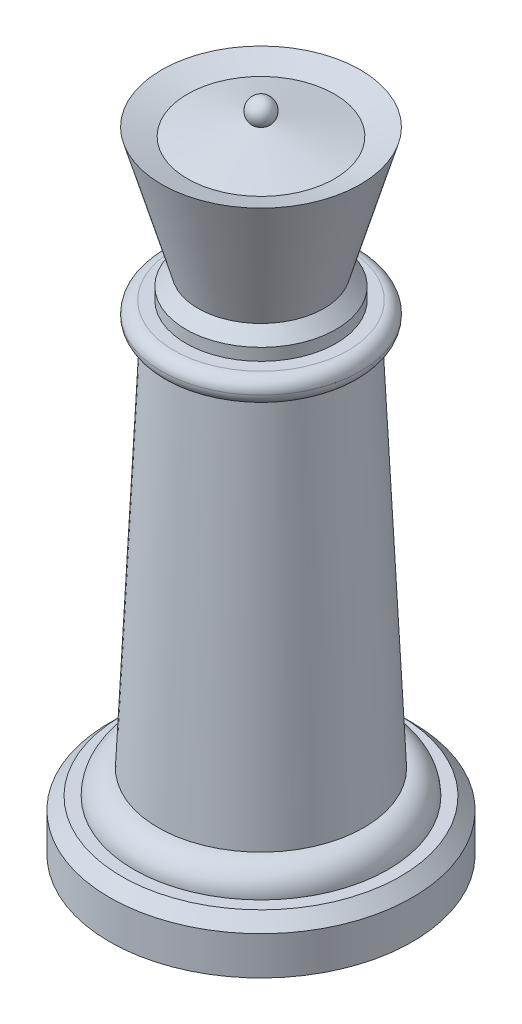
ISO-10303-21;
HEADER;
FILE_DESCRIPTION(('STEP AP214'),'2;1');
FILE_NAME('part.step','',(''),(''),'','','');
FILE_SCHEMA(('AUTOMOTIVE_DESIGN { 1 0 10303 214 1 1 1 1 }'));
ENDSEC;
DATA;
#1=APPLICATION_CONTEXT('core data for automotive mechanical design processes');
#2=APPLICATION_PROTOCOL_DEFINITION('international standard','automotive_design',2000,#1);
#3=PRODUCT_CONTEXT('',#1,'mechanical');
#4=PRODUCT('Part','Part','',(#3));
#5=PRODUCT_RELATED_PRODUCT_CATEGORY('part','',(#4));
#6=PRODUCT_DEFINITION_FORMATION('','',#4);
#7=PRODUCT_DEFINITION_CONTEXT('part definition',#1,'design');
#8=PRODUCT_DEFINITION('design','',#6,#7);
#9=PRODUCT_DEFINITION_SHAPE('','',#8);
#10=(LENGTH_UNIT() NAMED_UNIT(*) SI_UNIT(.MILLI.,.METRE.));
#11=(NAMED_UNIT(*) PLANE_ANGLE_UNIT() SI_UNIT($,.RADIAN.));
#12=(NAMED_UNIT(*) SI_UNIT($,.STERADIAN.) SOLID_ANGLE_UNIT());
#13=UNCERTAINTY_MEASURE_WITH_UNIT(LENGTH_MEASURE(1.E-05),#10,'distance_accuracy_value','');
#14=(GEOMETRIC_REPRESENTATION_CONTEXT(3) GLOBAL_UNCERTAINTY_ASSIGNED_CONTEXT((#13)) GLOBAL_UNIT_ASSIGNED_CONTEXT((#10,
#11,#12)) REPRESENTATION_CONTEXT('',''));
#15=CARTESIAN_POINT('',(0.,0.,0.));
#16=DIRECTION('',(0.,0.,1.));
#17=DIRECTION('',(1.,0.,0.));
#18=AXIS2_PLACEMENT_3D('',#15,#16,#17);
#19=CARTESIAN_POINT('',(0.,40.513,0.));
#20=DIRECTION('',(0.,-1.,0.));
#21=DIRECTION('',(1.,0.,0.));
#22=AXIS2_PLACEMENT_3D('',#19,#20,#21);
#23=SPHERICAL_SURFACE('',#22,0.761999999999999);
#24=CARTESIAN_POINT('',(0.,40.0068172622312,0.));
#25=DIRECTION('',(0.,-1.,0.));
#26=DIRECTION('',(0.,0.,-1.));
#27=AXIS2_PLACEMENT_3D('',#24,#25,#26);
#28=CIRCLE('',#27,0.569581456847854);
#29=CARTESIAN_POINT('',(0.,40.0068172622312,-0.569581456847838));
#30=VERTEX_POINT('',#29);
#31=EDGE_CURVE('E56',#30,#30,#28,.T.);
#32=ORIENTED_EDGE('',*,*,#31,.F.);
#33=EDGE_LOOP('',(#32));
#34=FACE_BOUND('',#33,.T.);
#35=ADVANCED_FACE('F33',(#34),#23,.T.);
#36=CARTESIAN_POINT('',(0.,40.0068172622312,0.));
#37=DIRECTION('',(0.,-1.,0.));
#38=DIRECTION('',(0.,0.,-1.));
#39=AXIS2_PLACEMENT_3D('',#36,#37,#38);
#40=CONICAL_SURFACE('',#39,0.569581456847854,1.3544556654216);
#41=CARTESIAN_POINT('',(0.,39.116,0.));
#42=DIRECTION('',(0.,-1.,0.));
#43=DIRECTION('',(0.,0.,-1.));
#44=AXIS2_PLACEMENT_3D('',#41,#42,#43);
#45=CIRCLE('',#44,4.6228);
#46=CARTESIAN_POINT('',(0.,39.116,-4.62279999999998));
#47=VERTEX_POINT('',#46);
#48=EDGE_CURVE('E59',#47,#47,#45,.T.);
#49=CARTESIAN_POINT('',(0.,39.116,-4.62279999999998));
#50=CARTESIAN_POINT('',(0.,39.1252793464816,-4.58057897350882));
#51=CARTESIAN_POINT('',(0.,39.1345586929632,-4.53835794701765));
#52=CARTESIAN_POINT('',(0.,39.1531173859263,-4.45391589403531));
#53=CARTESIAN_POINT('',(0.,39.1623967324079,-4.41169486754414));
#54=CARTESIAN_POINT('',(0.,39.180955425371,-4.32725281456181));
#55=CARTESIAN_POINT('',(0.,39.1902347718526,-4.28503178807064));
#56=CARTESIAN_POINT('',(0.,39.2087934648158,-4.2005897350883));
#57=CARTESIAN_POINT('',(0.,39.2180728112973,-4.15836870859713));
#58=CARTESIAN_POINT('',(0.,39.2366315042605,-4.0739266556148));
#59=CARTESIAN_POINT('',(0.,39.2459108507421,-4.03170562912363));
#60=CARTESIAN_POINT('',(0.,39.2644695437052,-3.94726357614129));
#61=CARTESIAN_POINT('',(0.,39.2737488901868,-3.90504254965012));
#62=CARTESIAN_POINT('',(0.,39.2923075831499,-3.82060049666779));
#63=CARTESIAN_POINT('',(0.,39.3015869296315,-3.77837947017662));
#64=CARTESIAN_POINT('',(0.,39.3201456225947,-3.69393741719428));
#65=CARTESIAN_POINT('',(0.,39.3294249690762,-3.65171639070312));
#66=CARTESIAN_POINT('',(0.,39.3479836620394,-3.56727433772078));
#67=CARTESIAN_POINT('',(0.,39.357263008521,-3.52505331122961));
#68=CARTESIAN_POINT('',(0.,39.3758217014841,-3.44061125824727));
#69=CARTESIAN_POINT('',(0.,39.3851010479657,-3.39839023175611));
#70=CARTESIAN_POINT('',(0.,39.4036597409288,-3.31394817877377));
#71=CARTESIAN_POINT('',(0.,39.4129390874104,-3.2717271522826));
#72=CARTESIAN_POINT('',(0.,39.4314977803736,-3.18728509930027));
#73=CARTESIAN_POINT('',(0.,39.4407771268551,-3.1450640728091));
#74=CARTESIAN_POINT('',(0.,39.4593358198183,-3.06062201982676));
#75=CARTESIAN_POINT('',(0.,39.4686151662999,-3.01840099333559));
#76=CARTESIAN_POINT('',(0.,39.487173859263,-2.93395894035326));
#77=CARTESIAN_POINT('',(0.,39.4964532057446,-2.89173791386209));
#78=CARTESIAN_POINT('',(0.,39.5150118987077,-2.80729586087975));
#79=CARTESIAN_POINT('',(0.,39.5242912451893,-2.76507483438858));
#80=CARTESIAN_POINT('',(0.,39.5428499381525,-2.68063278140625));
#81=CARTESIAN_POINT('',(0.,39.552129284634,-2.63841175491508));
#82=CARTESIAN_POINT('',(0.,39.5706879775972,-2.55396970193274));
#83=CARTESIAN_POINT('',(0.,39.5799673240788,-2.51174867544157));
#84=CARTESIAN_POINT('',(0.,39.5985260170419,-2.42730662245924));
#85=CARTESIAN_POINT('',(0.,39.6078053635235,-2.38508559596807));
#86=CARTESIAN_POINT('',(0.,39.6263640564867,-2.30064354298573));
#87=CARTESIAN_POINT('',(0.,39.6356434029682,-2.25842251649457));
#88=CARTESIAN_POINT('',(0.,39.6542020959314,-2.17398046351223));
#89=CARTESIAN_POINT('',(0.,39.663481442413,-2.13175943702106));
#90=CARTESIAN_POINT('',(0.,39.6820401353761,-2.04731738403872));
#91=CARTESIAN_POINT('',(0.,39.6913194818577,-2.00509635754756));
#92=CARTESIAN_POINT('',(0.,39.7098781748208,-1.92065430456522));
#93=CARTESIAN_POINT('',(0.,39.7191575213024,-1.87843327807405));
#94=CARTESIAN_POINT('',(0.,39.7377162142656,-1.79399122509172));
#95=CARTESIAN_POINT('',(0.,39.7469955607471,-1.75177019860055));
#96=CARTESIAN_POINT('',(0.,39.7655542537103,-1.66732814561821));
#97=CARTESIAN_POINT('',(0.,39.7748336001919,-1.62510711912704));
#98=CARTESIAN_POINT('',(0.,39.793392293155,-1.54066506614471));
#99=CARTESIAN_POINT('',(0.,39.8026716396366,-1.49844403965354));
#100=CARTESIAN_POINT('',(0.,39.8212303325997,-1.4140019866712));
#101=CARTESIAN_POINT('',(0.,39.8305096790813,-1.37178096018003));
#102=CARTESIAN_POINT('',(0.,39.8490683720445,-1.2873389071977));
#103=CARTESIAN_POINT('',(0.,39.858347718526,-1.24511788070653));
#104=CARTESIAN_POINT('',(0.,39.8769064114892,-1.16067582772419));
#105=CARTESIAN_POINT('',(0.,39.8861857579708,-1.11845480123302));
#106=CARTESIAN_POINT('',(0.,39.9047444509339,-1.03401274825069));
#107=CARTESIAN_POINT('',(0.,39.9140237974155,-0.99179172175952));
#108=CARTESIAN_POINT('',(0.,39.9325824903786,-0.907349668777184));
#109=CARTESIAN_POINT('',(0.,39.9418618368602,-0.865128642286015));
#110=CARTESIAN_POINT('',(0.,39.9604205298234,-0.780686589303679));
#111=CARTESIAN_POINT('',(0.,39.969699876305,-0.738465562812511));
#112=CARTESIAN_POINT('',(0.,39.9882585692681,-0.654023509830175));
#113=CARTESIAN_POINT('',(0.,39.9975379157497,-0.611802483339006));
#114=CARTESIAN_POINT('',(0.,40.0068172622313,-0.569581456847838));
#115=B_SPLINE_CURVE_WITH_KNOTS('',3,(#49,#50,#51,#52,#53,#54,#55,#56,#57,#58,#59,#60,#61,#62,
#63,#64,#65,#66,#67,#68,#69,#70,#71,#72,#73,#74,#75,#76,#77,#78,#79,#80,#81,#82,#83,#84,#85,#86,
#87,#88,#89,#90,#91,#92,#93,#94,#95,#96,#97,#98,#99,#100,#101,#102,#103,#104,#105,#106,#107,
#108,#109,#110,#111,#112,#113,#114),.UNSPECIFIED.,.F.,.F.,(4,2,2,2,2,2,2,2,2,2,2,2,2,2,2,2,2,2,
2,2,2,2,2,2,2,2,2,2,2,2,2,2,4),(0.,0.129686129334781,0.259372258669562,0.389058388004343,
0.518744517339124,0.648430646673905,0.778116776008686,0.907802905343466,1.03748903467825,
1.16717516401303,1.29686129334781,1.42654742268259,1.55623355201737,1.68591968135215,
1.81560581068693,1.94529194002171,2.07497806935649,2.20466419869127,2.33435032802605,
2.46403645736084,2.59372258669561,2.7234087160304,2.85309484536518,2.98278097469996,
3.11246710403474,3.24215323336952,3.3718393627043,3.50152549203908,3.63121162137386,
3.76089775070864,3.89058388004342,4.0202700093782,4.14995613871299),.UNSPECIFIED.);
#116=EDGE_CURVE('BSEAM101',#47,#30,#115,.T.);
#117=ORIENTED_EDGE('',*,*,#48,.F.);
#118=ORIENTED_EDGE('',*,*,#31,.T.);
#119=ORIENTED_EDGE('',*,*,#116,.T.);
#120=ORIENTED_EDGE('',*,*,#116,.F.);
#121=EDGE_LOOP('',(#117,#119,#118,#120));
#122=FACE_BOUND('',#121,.T.);
#123=ADVANCED_FACE('F101',(#122),#40,.T.);
#124=CARTESIAN_POINT('',(0.,39.116,0.));
#125=DIRECTION('',(0.,1.,0.));
#126=DIRECTION('',(0.,0.,1.));
#127=AXIS2_PLACEMENT_3D('',#124,#125,#126);
#128=CONICAL_SURFACE('',#127,4.6228,1.26791145841992);
#129=CARTESIAN_POINT('',(0.,39.624,0.));
#130=DIRECTION('',(0.,-1.,0.));
#131=DIRECTION('',(0.,0.,-1.));
#132=AXIS2_PLACEMENT_3D('',#129,#130,#131);
#133=CIRCLE('',#132,6.2484);
#134=CARTESIAN_POINT('',(0.,39.624,-6.2484));
#135=VERTEX_POINT('',#134);
#136=EDGE_CURVE('E62',#135,#135,#133,.T.);
#137=ORIENTED_EDGE('',*,*,#136,.F.);
#138=EDGE_LOOP('',(#137));
#139=FACE_BOUND('',#138,.T.);
#140=ORIENTED_EDGE('',*,*,#48,.T.);
#141=EDGE_LOOP('',(#140));
#142=FACE_BOUND('',#141,.T.);
#143=ADVANCED_FACE('F107',(#139,#142),#128,.F.);
#144=CARTESIAN_POINT('',(0.,39.624,0.));
#145=DIRECTION('',(0.,1.,0.));
#146=DIRECTION('',(0.,0.,1.));
#147=AXIS2_PLACEMENT_3D('',#144,#145,#146);
#148=CONICAL_SURFACE('',#147,6.2484,0.281693791071137);
#149=CARTESIAN_POINT('',(0.,31.7246,0.));
#150=DIRECTION('',(0.,-1.,0.));
#151=DIRECTION('',(0.,0.,-1.));
#152=AXIS2_PLACEMENT_3D('',#149,#150,#151);
#153=CIRCLE('',#152,3.9624);
#154=CARTESIAN_POINT('',(0.,31.7246,-3.9624));
#155=VERTEX_POINT('',#154);
#156=EDGE_CURVE('E65',#155,#155,#153,.T.);
#157=ORIENTED_EDGE('',*,*,#156,.F.);
#158=EDGE_LOOP('',(#157));
#159=FACE_BOUND('',#158,.T.);
#160=ORIENTED_EDGE('',*,*,#136,.T.);
#161=EDGE_LOOP('',(#160));
#162=FACE_BOUND('',#161,.T.);
#163=ADVANCED_FACE('F159',(#159,#162),#148,.T.);
#164=CARTESIAN_POINT('',(0.,0.,0.));
#165=DIRECTION('',(0.,-1.,0.));
#166=DIRECTION('',(0.,0.,-1.));
#167=AXIS2_PLACEMENT_3D('',#164,#165,#166);
#168=CYLINDRICAL_SURFACE('',#167,4.7244);
#169=CARTESIAN_POINT('',(0.,30.9626,0.));
#170=DIRECTION('',(0.,-1.,0.));
#171=DIRECTION('',(0.,0.,-1.));
#172=AXIS2_PLACEMENT_3D('',#169,#170,#171);
#173=CIRCLE('',#172,4.7244);
#174=CARTESIAN_POINT('',(0.,30.9626,-4.7244));
#175=VERTEX_POINT('',#174);
#176=EDGE_CURVE('E53',#175,#175,#173,.T.);
#177=ORIENTED_EDGE('',*,*,#176,.T.);
#178=EDGE_LOOP('',(#177));
#179=FACE_BOUND('',#178,.T.);
#180=CARTESIAN_POINT('',(0.,30.2006,0.));
#181=DIRECTION('',(0.,-1.,0.));
#182=DIRECTION('',(0.,0.,-1.));
#183=AXIS2_PLACEMENT_3D('',#180,#181,#182);
#184=CIRCLE('',#183,4.7244);
#185=CARTESIAN_POINT('',(0.,30.2006,-4.7244));
#186=VERTEX_POINT('',#185);
#187=EDGE_CURVE('E68',#186,#186,#184,.T.);
#188=ORIENTED_EDGE('',*,*,#187,.F.);
#189=EDGE_LOOP('',(#188));
#190=FACE_BOUND('',#189,.T.);
#191=ADVANCED_FACE('F155',(#179,#190),#168,.T.);
#192=CARTESIAN_POINT('',(-4.7244,30.2006,0.));
#193=DIRECTION('',(0.,-1.,0.));
#194=DIRECTION('',(0.,0.,-1.));
#195=AXIS2_PLACEMENT_3D('',#192,#193,#194);
#196=PLANE('',#195);
#197=CARTESIAN_POINT('',(0.,30.2006,0.));
#198=DIRECTION('',(0.,-1.,0.));
#199=DIRECTION('',(0.,0.,-1.));
#200=AXIS2_PLACEMENT_3D('',#197,#198,#199);
#201=CIRCLE('',#200,5.4864);
#202=CARTESIAN_POINT('',(0.,30.2006,-5.4864));
#203=VERTEX_POINT('',#202);
#204=EDGE_CURVE('E41',#203,#203,#201,.F.);
#205=ORIENTED_EDGE('',*,*,#204,.T.);
#206=EDGE_LOOP('',(#205));
#207=FACE_BOUND('',#206,.T.);
#208=ORIENTED_EDGE('',*,*,#187,.T.);
#209=EDGE_LOOP('',(#208));
#210=FACE_BOUND('',#209,.T.);
#211=ADVANCED_FACE('F152',(#207,#210),#196,.F.);
#212=CARTESIAN_POINT('',(-5.3848,28.6766,0.));
#213=DIRECTION('',(0.,1.,0.));
#214=DIRECTION('',(0.,0.,1.));
#215=AXIS2_PLACEMENT_3D('',#212,#213,#214);
#216=PLANE('',#215);
#217=CARTESIAN_POINT('',(0.,28.6766,0.));
#218=DIRECTION('',(0.,1.,0.));
#219=DIRECTION('',(0.,0.,1.));
#220=AXIS2_PLACEMENT_3D('',#217,#218,#219);
#221=CIRCLE('',#220,5.4864);
#222=CARTESIAN_POINT('',(0.,28.6766,5.4864));
#223=VERTEX_POINT('',#222);
#224=EDGE_CURVE('E10',#223,#223,#221,.F.);
#225=ORIENTED_EDGE('',*,*,#224,.T.);
#226=EDGE_LOOP('',(#225));
#227=FACE_BOUND('',#226,.T.);
#228=CARTESIAN_POINT('',(0.,28.6766,0.));
#229=DIRECTION('',(0.,-1.,0.));
#230=DIRECTION('',(0.,0.,-1.));
#231=AXIS2_PLACEMENT_3D('',#228,#229,#230);
#232=CIRCLE('',#231,5.3848);
#233=CARTESIAN_POINT('',(0.,28.6766,-5.3848));
#234=VERTEX_POINT('',#233);
#235=EDGE_CURVE('E71',#234,#234,#232,.T.);
#236=ORIENTED_EDGE('',*,*,#235,.F.);
#237=EDGE_LOOP('',(#236));
#238=FACE_BOUND('',#237,.T.);
#239=ADVANCED_FACE('F148',(#227,#238),#216,.F.);
#240=CARTESIAN_POINT('',(0.,28.6766,0.));
#241=DIRECTION('',(0.,-1.,0.));
#242=DIRECTION('',(0.,0.,-1.));
#243=AXIS2_PLACEMENT_3D('',#240,#241,#242);
#244=CONICAL_SURFACE('',#243,5.3848,0.0455193824437213);
#245=CARTESIAN_POINT('',(0.,4.699,0.));
#246=DIRECTION('',(0.,-1.,0.));
#247=DIRECTION('',(0.,0.,-1.));
#248=AXIS2_PLACEMENT_3D('',#245,#246,#247);
#249=CIRCLE('',#248,6.477);
#250=CARTESIAN_POINT('',(0.,4.699,-6.477));
#251=VERTEX_POINT('',#250);
#252=EDGE_CURVE('E74',#251,#251,#249,.T.);
#253=ORIENTED_EDGE('',*,*,#252,.F.);
#254=EDGE_LOOP('',(#253));
#255=FACE_BOUND('',#254,.T.);
#256=ORIENTED_EDGE('',*,*,#235,.T.);
#257=EDGE_LOOP('',(#256));
#258=FACE_BOUND('',#257,.T.);
#259=ADVANCED_FACE('F142',(#255,#258),#244,.T.);
#260=CARTESIAN_POINT('',(-8.001,3.175,0.));
#261=DIRECTION('',(0.,-1.,0.));
#262=DIRECTION('',(0.,0.,-1.));
#263=AXIS2_PLACEMENT_3D('',#260,#261,#262);
#264=PLANE('',#263);
#265=CARTESIAN_POINT('',(0.,3.175,0.));
#266=DIRECTION('',(0.,-1.,0.));
#267=DIRECTION('',(0.,0.,-1.));
#268=AXIS2_PLACEMENT_3D('',#265,#266,#267);
#269=CIRCLE('',#268,8.763);
#270=CARTESIAN_POINT('',(0.,3.175,-8.763));
#271=VERTEX_POINT('',#270);
#272=EDGE_CURVE('E45',#271,#271,#269,.F.);
#273=ORIENTED_EDGE('',*,*,#272,.T.);
#274=EDGE_LOOP('',(#273));
#275=FACE_BOUND('',#274,.T.);
#276=CARTESIAN_POINT('',(0.,3.175,0.));
#277=DIRECTION('',(0.,-1.,0.));
#278=DIRECTION('',(0.,0.,-1.));
#279=AXIS2_PLACEMENT_3D('',#276,#277,#278);
#280=CIRCLE('',#279,8.001);
#281=CARTESIAN_POINT('',(0.,3.175,-8.001));
#282=VERTEX_POINT('',#281);
#283=EDGE_CURVE('E77',#282,#282,#280,.T.);
#284=ORIENTED_EDGE('',*,*,#283,.T.);
#285=EDGE_LOOP('',(#284));
#286=FACE_BOUND('',#285,.T.);
#287=ADVANCED_FACE('F135',(#275,#286),#264,.F.);
#288=CARTESIAN_POINT('',(0.,0.,0.));
#289=DIRECTION('',(0.,-1.,0.));
#290=DIRECTION('',(0.,0.,-1.));
#291=AXIS2_PLACEMENT_3D('',#288,#289,#290);
#292=CYLINDRICAL_SURFACE('',#291,9.525);
#293=CARTESIAN_POINT('',(0.,2.413,0.));
#294=DIRECTION('',(0.,-1.,0.));
#295=DIRECTION('',(0.,0.,-1.));
#296=AXIS2_PLACEMENT_3D('',#293,#294,#295);
#297=CIRCLE('',#296,9.525);
#298=CARTESIAN_POINT('',(0.,2.413,-9.525));
#299=VERTEX_POINT('',#298);
#300=EDGE_CURVE('E50',#299,#299,#297,.T.);
#301=ORIENTED_EDGE('',*,*,#300,.T.);
#302=EDGE_LOOP('',(#301));
#303=FACE_BOUND('',#302,.T.);
#304=CARTESIAN_POINT('',(0.,0.,0.));
#305=DIRECTION('',(0.,-1.,0.));
#306=DIRECTION('',(0.,0.,-1.));
#307=AXIS2_PLACEMENT_3D('',#304,#305,#306);
#308=CIRCLE('',#307,9.525);
#309=CARTESIAN_POINT('',(0.,0.,-9.525));
#310=VERTEX_POINT('',#309);
#311=EDGE_CURVE('E80',#310,#310,#308,.T.);
#312=ORIENTED_EDGE('',*,*,#311,.F.);
#313=EDGE_LOOP('',(#312));
#314=FACE_BOUND('',#313,.T.);
#315=ADVANCED_FACE('F132',(#303,#314),#292,.T.);
#316=CARTESIAN_POINT('',(0.,0.,0.));
#317=DIRECTION('',(0.,1.,0.));
#318=DIRECTION('',(0.,0.,1.));
#319=AXIS2_PLACEMENT_3D('',#316,#317,#318);
#320=PLANE('',#319);
#321=ORIENTED_EDGE('',*,*,#311,.T.);
#322=EDGE_LOOP('',(#321));
#323=FACE_BOUND('',#322,.T.);
#324=ADVANCED_FACE('F120',(#323),#320,.F.);
#325=CARTESIAN_POINT('',(0.,30.9626,0.));
#326=DIRECTION('',(0.,-1.,0.));
#327=DIRECTION('',(0.,0.,-1.));
#328=AXIS2_PLACEMENT_3D('',#325,#326,#327);
#329=CONICAL_SURFACE('',#328,4.7244,0.785398163397446);
#330=ORIENTED_EDGE('',*,*,#156,.T.);
#331=EDGE_LOOP('',(#330));
#332=FACE_BOUND('',#331,.T.);
#333=ORIENTED_EDGE('',*,*,#176,.F.);
#334=EDGE_LOOP('',(#333));
#335=FACE_BOUND('',#334,.T.);
#336=ADVANCED_FACE('F114',(#332,#335),#329,.T.);
#337=CARTESIAN_POINT('',(0.,2.413,0.));
#338=DIRECTION('',(0.,-1.,0.));
#339=DIRECTION('',(0.,0.,-1.));
#340=AXIS2_PLACEMENT_3D('',#337,#338,#339);
#341=CONICAL_SURFACE('',#340,9.525,0.785398163397451);
#342=ORIENTED_EDGE('',*,*,#272,.F.);
#343=EDGE_LOOP('',(#342));
#344=FACE_BOUND('',#343,.T.);
#345=ORIENTED_EDGE('',*,*,#300,.F.);
#346=EDGE_LOOP('',(#345));
#347=FACE_BOUND('',#346,.T.);
#348=ADVANCED_FACE('F97',(#344,#347),#341,.T.);
#349=CARTESIAN_POINT('',(0.,3.175,0.));
#350=DIRECTION('',(0.,-1.,0.));
#351=DIRECTION('',(0.,0.,-1.));
#352=AXIS2_PLACEMENT_3D('',#349,#350,#351);
#353=TOROIDAL_SURFACE('',#352,6.477,1.524);
#354=ORIENTED_EDGE('',*,*,#252,.T.);
#355=EDGE_LOOP('',(#354));
#356=FACE_BOUND('',#355,.T.);
#357=ORIENTED_EDGE('',*,*,#283,.F.);
#358=EDGE_LOOP('',(#357));
#359=FACE_BOUND('',#358,.T.);
#360=ADVANCED_FACE('F90',(#356,#359),#353,.T.);
#361=CARTESIAN_POINT('',(0.,29.4386,0.));
#362=DIRECTION('',(0.,1.,0.));
#363=DIRECTION('',(0.,0.,1.));
#364=AXIS2_PLACEMENT_3D('',#361,#362,#363);
#365=TOROIDAL_SURFACE('',#364,5.4864,0.762);
#366=ORIENTED_EDGE('',*,*,#224,.F.);
#367=EDGE_LOOP('',(#366));
#368=FACE_BOUND('',#367,.T.);
#369=CARTESIAN_POINT('',(0.,29.4386,0.));
#370=DIRECTION('',(0.,1.,0.));
#371=DIRECTION('',(0.,0.,1.));
#372=AXIS2_PLACEMENT_3D('',#369,#370,#371);
#373=CIRCLE('',#372,6.2484);
#374=CARTESIAN_POINT('',(0.,29.4386,6.2484));
#375=VERTEX_POINT('',#374);
#376=EDGE_CURVE('E37',#375,#375,#373,.T.);
#377=ORIENTED_EDGE('',*,*,#376,.F.);
#378=EDGE_LOOP('',(#377));
#379=FACE_BOUND('',#378,.T.);
#380=ADVANCED_FACE('F35',(#368,#379),#365,.T.);
#381=CARTESIAN_POINT('',(0.,29.4386,0.));
#382=DIRECTION('',(0.,-1.,0.));
#383=DIRECTION('',(0.,0.,-1.));
#384=AXIS2_PLACEMENT_3D('',#381,#382,#383);
#385=TOROIDAL_SURFACE('',#384,5.4864,0.762);
#386=ORIENTED_EDGE('',*,*,#204,.F.);
#387=EDGE_LOOP('',(#386));
#388=FACE_BOUND('',#387,.T.);
#389=ORIENTED_EDGE('',*,*,#376,.T.);
#390=EDGE_LOOP('',(#389));
#391=FACE_BOUND('',#390,.T.);
#392=ADVANCED_FACE('F87',(#388,#391),#385,.T.);
#393=CLOSED_SHELL('',(#35,#123,#143,#163,#191,#211,#239,#259,#287,#315,#324,#336,#348,#360,#380,#392));
#394=MANIFOLD_SOLID_BREP('B2',#393);
#395=ADVANCED_BREP_SHAPE_REPRESENTATION('',(#18,#394),#14);
#396=SHAPE_DEFINITION_REPRESENTATION(#9,#395);
ENDSEC;
END-ISO-10303-21;
